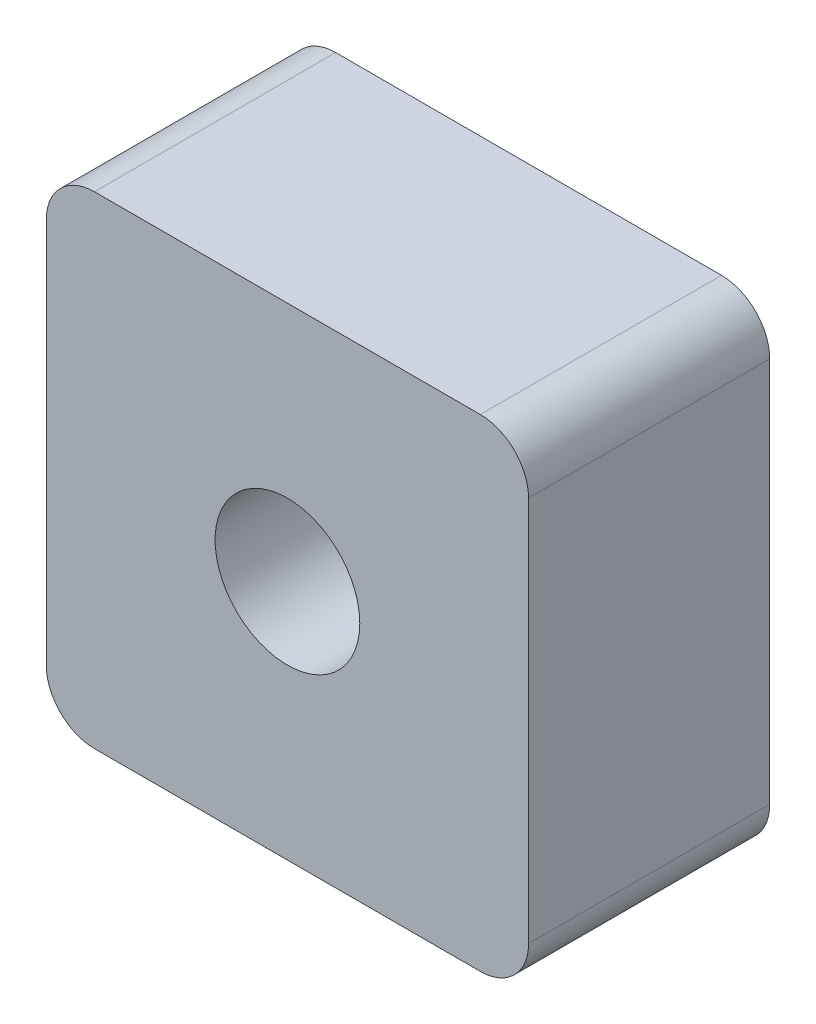
ISO-10303-21;
HEADER;
FILE_DESCRIPTION(('STEP AP214'),'2;1');
FILE_NAME('part.step','',(''),(''),'','','');
FILE_SCHEMA(('AUTOMOTIVE_DESIGN { 1 0 10303 214 1 1 1 1 }'));
ENDSEC;
DATA;
#1=APPLICATION_CONTEXT('core data for automotive mechanical design processes');
#2=APPLICATION_PROTOCOL_DEFINITION('international standard','automotive_design',2000,#1);
#3=PRODUCT_CONTEXT('',#1,'mechanical');
#4=PRODUCT('Part','Part','',(#3));
#5=PRODUCT_RELATED_PRODUCT_CATEGORY('part','',(#4));
#6=PRODUCT_DEFINITION_FORMATION('','',#4);
#7=PRODUCT_DEFINITION_CONTEXT('part definition',#1,'design');
#8=PRODUCT_DEFINITION('design','',#6,#7);
#9=PRODUCT_DEFINITION_SHAPE('','',#8);
#10=(LENGTH_UNIT() NAMED_UNIT(*) SI_UNIT(.MILLI.,.METRE.));
#11=(NAMED_UNIT(*) PLANE_ANGLE_UNIT() SI_UNIT($,.RADIAN.));
#12=(NAMED_UNIT(*) SI_UNIT($,.STERADIAN.) SOLID_ANGLE_UNIT());
#13=UNCERTAINTY_MEASURE_WITH_UNIT(LENGTH_MEASURE(1.E-05),#10,'distance_accuracy_value','');
#14=(GEOMETRIC_REPRESENTATION_CONTEXT(3) GLOBAL_UNCERTAINTY_ASSIGNED_CONTEXT((#13)) GLOBAL_UNIT_ASSIGNED_CONTEXT((#10,
#11,#12)) REPRESENTATION_CONTEXT('',''));
#15=CARTESIAN_POINT('',(0.,0.,0.));
#16=DIRECTION('',(0.,0.,1.));
#17=DIRECTION('',(1.,0.,0.));
#18=AXIS2_PLACEMENT_3D('',#15,#16,#17);
#19=CARTESIAN_POINT('',(0.,0.,0.));
#20=DIRECTION('',(0.,0.,1.));
#21=DIRECTION('',(1.,0.,0.));
#22=AXIS2_PLACEMENT_3D('',#19,#20,#21);
#23=PLANE('',#22);
#24=CARTESIAN_POINT('',(0.,0.,0.));
#25=DIRECTION('',(0.,0.,1.));
#26=DIRECTION('',(1.,0.,0.));
#27=AXIS2_PLACEMENT_3D('',#24,#25,#26);
#28=CIRCLE('',#27,3.);
#29=CARTESIAN_POINT('',(3.,0.,0.));
#30=VERTEX_POINT('',#29);
#31=EDGE_CURVE('E129',#30,#30,#28,.T.);
#32=ORIENTED_EDGE('',*,*,#31,.T.);
#33=EDGE_LOOP('',(#32));
#34=FACE_BOUND('',#33,.T.);
#35=DIRECTION('',(0.,1.,0.));
#36=VECTOR('',#35,1.);
#37=CARTESIAN_POINT('',(10.,8.,0.));
#38=LINE('',#37,#36);
#39=CARTESIAN_POINT('',(10.,-8.,0.));
#40=VERTEX_POINT('',#39);
#41=CARTESIAN_POINT('',(10.,8.,0.));
#42=VERTEX_POINT('',#41);
#43=EDGE_CURVE('E78',#40,#42,#38,.T.);
#44=ORIENTED_EDGE('',*,*,#43,.F.);
#45=CARTESIAN_POINT('',(8.,-8.,0.));
#46=DIRECTION('',(0.,0.,1.));
#47=DIRECTION('',(1.,0.,0.));
#48=AXIS2_PLACEMENT_3D('',#45,#46,#47);
#49=CIRCLE('',#48,2.);
#50=CARTESIAN_POINT('',(8.,-10.,0.));
#51=VERTEX_POINT('',#50);
#52=EDGE_CURVE('E133',#51,#40,#49,.T.);
#53=ORIENTED_EDGE('',*,*,#52,.F.);
#54=DIRECTION('',(1.,0.,0.));
#55=VECTOR('',#54,1.);
#56=CARTESIAN_POINT('',(8.,-10.,0.));
#57=LINE('',#56,#55);
#58=CARTESIAN_POINT('',(-8.,-10.,0.));
#59=VERTEX_POINT('',#58);
#60=EDGE_CURVE('E109',#59,#51,#57,.T.);
#61=ORIENTED_EDGE('',*,*,#60,.F.);
#62=CARTESIAN_POINT('',(-8.,-8.,0.));
#63=DIRECTION('',(0.,0.,1.));
#64=DIRECTION('',(1.,0.,0.));
#65=AXIS2_PLACEMENT_3D('',#62,#63,#64);
#66=CIRCLE('',#65,2.);
#67=CARTESIAN_POINT('',(-10.,-8.,0.));
#68=VERTEX_POINT('',#67);
#69=EDGE_CURVE('E136',#68,#59,#66,.T.);
#70=ORIENTED_EDGE('',*,*,#69,.F.);
#71=DIRECTION('',(0.,1.,0.));
#72=VECTOR('',#71,1.);
#73=CARTESIAN_POINT('',(-10.,-8.,0.));
#74=LINE('',#73,#72);
#75=CARTESIAN_POINT('',(-10.,8.,0.));
#76=VERTEX_POINT('',#75);
#77=EDGE_CURVE('E112',#76,#68,#74,.F.);
#78=ORIENTED_EDGE('',*,*,#77,.F.);
#79=CARTESIAN_POINT('',(-8.,8.,0.));
#80=DIRECTION('',(0.,0.,1.));
#81=DIRECTION('',(1.,0.,0.));
#82=AXIS2_PLACEMENT_3D('',#79,#80,#81);
#83=CIRCLE('',#82,2.);
#84=CARTESIAN_POINT('',(-8.,10.,0.));
#85=VERTEX_POINT('',#84);
#86=EDGE_CURVE('E94',#85,#76,#83,.T.);
#87=ORIENTED_EDGE('',*,*,#86,.F.);
#88=DIRECTION('',(1.,0.,0.));
#89=VECTOR('',#88,1.);
#90=CARTESIAN_POINT('',(-8.,10.,0.));
#91=LINE('',#90,#89);
#92=CARTESIAN_POINT('',(8.,10.,0.));
#93=VERTEX_POINT('',#92);
#94=EDGE_CURVE('E92',#93,#85,#91,.F.);
#95=ORIENTED_EDGE('',*,*,#94,.F.);
#96=CARTESIAN_POINT('',(8.,8.,0.));
#97=DIRECTION('',(0.,0.,1.));
#98=DIRECTION('',(1.,0.,0.));
#99=AXIS2_PLACEMENT_3D('',#96,#97,#98);
#100=CIRCLE('',#99,2.);
#101=EDGE_CURVE('E20',#42,#93,#100,.T.);
#102=ORIENTED_EDGE('',*,*,#101,.F.);
#103=EDGE_LOOP('',(#44,#53,#61,#70,#78,#87,#95,#102));
#104=FACE_BOUND('',#103,.T.);
#105=ADVANCED_FACE('F17',(#34,#104),#23,.F.);
#106=CARTESIAN_POINT('',(10.,8.,0.));
#107=DIRECTION('',(1.,0.,0.));
#108=DIRECTION('',(0.,0.,-1.));
#109=AXIS2_PLACEMENT_3D('',#106,#107,#108);
#110=PLANE('',#109);
#111=ORIENTED_EDGE('',*,*,#43,.T.);
#112=DIRECTION('',(0.,0.,1.));
#113=VECTOR('',#112,1.);
#114=CARTESIAN_POINT('',(10.,8.,0.));
#115=LINE('',#114,#113);
#116=CARTESIAN_POINT('',(10.,8.,10.));
#117=VERTEX_POINT('',#116);
#118=EDGE_CURVE('E89',#117,#42,#115,.F.);
#119=ORIENTED_EDGE('',*,*,#118,.F.);
#120=DIRECTION('',(0.,1.,0.));
#121=VECTOR('',#120,1.);
#122=CARTESIAN_POINT('',(10.,0.,10.));
#123=LINE('',#122,#121);
#124=CARTESIAN_POINT('',(10.,-8.,10.));
#125=VERTEX_POINT('',#124);
#126=EDGE_CURVE('E128',#125,#117,#123,.T.);
#127=ORIENTED_EDGE('',*,*,#126,.F.);
#128=DIRECTION('',(0.,0.,1.));
#129=VECTOR('',#128,1.);
#130=CARTESIAN_POINT('',(10.,-8.,0.));
#131=LINE('',#130,#129);
#132=EDGE_CURVE('E132',#40,#125,#131,.T.);
#133=ORIENTED_EDGE('',*,*,#132,.F.);
#134=EDGE_LOOP('',(#111,#119,#127,#133));
#135=FACE_BOUND('',#134,.T.);
#136=ADVANCED_FACE('F169',(#135),#110,.T.);
#137=CARTESIAN_POINT('',(8.,8.,0.));
#138=DIRECTION('',(0.,0.,1.));
#139=DIRECTION('',(1.,0.,0.));
#140=AXIS2_PLACEMENT_3D('',#137,#138,#139);
#141=CYLINDRICAL_SURFACE('',#140,2.);
#142=ORIENTED_EDGE('',*,*,#101,.T.);
#143=DIRECTION('',(0.,0.,1.));
#144=VECTOR('',#143,1.);
#145=CARTESIAN_POINT('',(8.,10.,0.));
#146=LINE('',#145,#144);
#147=CARTESIAN_POINT('',(8.,10.,10.));
#148=VERTEX_POINT('',#147);
#149=EDGE_CURVE('E87',#148,#93,#146,.F.);
#150=ORIENTED_EDGE('',*,*,#149,.F.);
#151=CARTESIAN_POINT('',(8.,8.,10.));
#152=DIRECTION('',(0.,0.,1.));
#153=DIRECTION('',(1.,0.,0.));
#154=AXIS2_PLACEMENT_3D('',#151,#152,#153);
#155=CIRCLE('',#154,2.);
#156=EDGE_CURVE('E126',#117,#148,#155,.T.);
#157=ORIENTED_EDGE('',*,*,#156,.F.);
#158=ORIENTED_EDGE('',*,*,#118,.T.);
#159=EDGE_LOOP('',(#142,#150,#157,#158));
#160=FACE_BOUND('',#159,.T.);
#161=ADVANCED_FACE('F84',(#160),#141,.T.);
#162=CARTESIAN_POINT('',(-8.,10.,0.));
#163=DIRECTION('',(0.,1.,0.));
#164=DIRECTION('',(0.,0.,1.));
#165=AXIS2_PLACEMENT_3D('',#162,#163,#164);
#166=PLANE('',#165);
#167=ORIENTED_EDGE('',*,*,#94,.T.);
#168=DIRECTION('',(0.,0.,1.));
#169=VECTOR('',#168,1.);
#170=CARTESIAN_POINT('',(-8.,10.,0.));
#171=LINE('',#170,#169);
#172=CARTESIAN_POINT('',(-8.,10.,10.));
#173=VERTEX_POINT('',#172);
#174=EDGE_CURVE('E97',#173,#85,#171,.F.);
#175=ORIENTED_EDGE('',*,*,#174,.F.);
#176=DIRECTION('',(1.,0.,0.));
#177=VECTOR('',#176,1.);
#178=CARTESIAN_POINT('',(0.,10.,10.));
#179=LINE('',#178,#177);
#180=EDGE_CURVE('E101',#148,#173,#179,.F.);
#181=ORIENTED_EDGE('',*,*,#180,.F.);
#182=ORIENTED_EDGE('',*,*,#149,.T.);
#183=EDGE_LOOP('',(#167,#175,#181,#182));
#184=FACE_BOUND('',#183,.T.);
#185=ADVANCED_FACE('F99',(#184),#166,.T.);
#186=CARTESIAN_POINT('',(-8.,8.,0.));
#187=DIRECTION('',(0.,0.,1.));
#188=DIRECTION('',(1.,0.,0.));
#189=AXIS2_PLACEMENT_3D('',#186,#187,#188);
#190=CYLINDRICAL_SURFACE('',#189,2.);
#191=ORIENTED_EDGE('',*,*,#86,.T.);
#192=DIRECTION('',(0.,0.,1.));
#193=VECTOR('',#192,1.);
#194=CARTESIAN_POINT('',(-10.,8.,0.));
#195=LINE('',#194,#193);
#196=CARTESIAN_POINT('',(-10.,8.,10.));
#197=VERTEX_POINT('',#196);
#198=EDGE_CURVE('E114',#197,#76,#195,.F.);
#199=ORIENTED_EDGE('',*,*,#198,.F.);
#200=CARTESIAN_POINT('',(-8.,8.,10.));
#201=DIRECTION('',(0.,0.,1.));
#202=DIRECTION('',(1.,0.,0.));
#203=AXIS2_PLACEMENT_3D('',#200,#201,#202);
#204=CIRCLE('',#203,2.);
#205=EDGE_CURVE('E123',#173,#197,#204,.T.);
#206=ORIENTED_EDGE('',*,*,#205,.F.);
#207=ORIENTED_EDGE('',*,*,#174,.T.);
#208=EDGE_LOOP('',(#191,#199,#206,#207));
#209=FACE_BOUND('',#208,.T.);
#210=ADVANCED_FACE('F140',(#209),#190,.T.);
#211=CARTESIAN_POINT('',(-10.,-8.,0.));
#212=DIRECTION('',(-1.,0.,0.));
#213=DIRECTION('',(0.,0.,1.));
#214=AXIS2_PLACEMENT_3D('',#211,#212,#213);
#215=PLANE('',#214);
#216=ORIENTED_EDGE('',*,*,#77,.T.);
#217=DIRECTION('',(0.,0.,1.));
#218=VECTOR('',#217,1.);
#219=CARTESIAN_POINT('',(-10.,-8.,0.));
#220=LINE('',#219,#218);
#221=CARTESIAN_POINT('',(-10.,-8.,10.));
#222=VERTEX_POINT('',#221);
#223=EDGE_CURVE('E113',#222,#68,#220,.F.);
#224=ORIENTED_EDGE('',*,*,#223,.F.);
#225=DIRECTION('',(0.,1.,0.));
#226=VECTOR('',#225,1.);
#227=CARTESIAN_POINT('',(-10.,0.,10.));
#228=LINE('',#227,#226);
#229=EDGE_CURVE('E122',#197,#222,#228,.F.);
#230=ORIENTED_EDGE('',*,*,#229,.F.);
#231=ORIENTED_EDGE('',*,*,#198,.T.);
#232=EDGE_LOOP('',(#216,#224,#230,#231));
#233=FACE_BOUND('',#232,.T.);
#234=ADVANCED_FACE('F164',(#233),#215,.T.);
#235=CARTESIAN_POINT('',(-8.,-8.,0.));
#236=DIRECTION('',(0.,0.,1.));
#237=DIRECTION('',(1.,0.,0.));
#238=AXIS2_PLACEMENT_3D('',#235,#236,#237);
#239=CYLINDRICAL_SURFACE('',#238,2.);
#240=ORIENTED_EDGE('',*,*,#69,.T.);
#241=DIRECTION('',(0.,0.,-1.));
#242=VECTOR('',#241,1.);
#243=CARTESIAN_POINT('',(-8.,-10.,0.));
#244=LINE('',#243,#242);
#245=CARTESIAN_POINT('',(-8.,-10.,10.));
#246=VERTEX_POINT('',#245);
#247=EDGE_CURVE('E111',#246,#59,#244,.T.);
#248=ORIENTED_EDGE('',*,*,#247,.F.);
#249=CARTESIAN_POINT('',(-8.,-8.,10.));
#250=DIRECTION('',(0.,0.,1.));
#251=DIRECTION('',(1.,0.,0.));
#252=AXIS2_PLACEMENT_3D('',#249,#250,#251);
#253=CIRCLE('',#252,2.);
#254=EDGE_CURVE('E119',#222,#246,#253,.T.);
#255=ORIENTED_EDGE('',*,*,#254,.F.);
#256=ORIENTED_EDGE('',*,*,#223,.T.);
#257=EDGE_LOOP('',(#240,#248,#255,#256));
#258=FACE_BOUND('',#257,.T.);
#259=ADVANCED_FACE('F160',(#258),#239,.T.);
#260=CARTESIAN_POINT('',(8.,-10.,0.));
#261=DIRECTION('',(0.,-1.,0.));
#262=DIRECTION('',(0.,0.,-1.));
#263=AXIS2_PLACEMENT_3D('',#260,#261,#262);
#264=PLANE('',#263);
#265=ORIENTED_EDGE('',*,*,#60,.T.);
#266=DIRECTION('',(0.,0.,1.));
#267=VECTOR('',#266,1.);
#268=CARTESIAN_POINT('',(8.,-10.,0.));
#269=LINE('',#268,#267);
#270=CARTESIAN_POINT('',(8.,-10.,10.));
#271=VERTEX_POINT('',#270);
#272=EDGE_CURVE('E35',#271,#51,#269,.F.);
#273=ORIENTED_EDGE('',*,*,#272,.F.);
#274=DIRECTION('',(1.,0.,0.));
#275=VECTOR('',#274,1.);
#276=CARTESIAN_POINT('',(0.,-10.,10.));
#277=LINE('',#276,#275);
#278=EDGE_CURVE('E118',#246,#271,#277,.T.);
#279=ORIENTED_EDGE('',*,*,#278,.F.);
#280=ORIENTED_EDGE('',*,*,#247,.T.);
#281=EDGE_LOOP('',(#265,#273,#279,#280));
#282=FACE_BOUND('',#281,.T.);
#283=ADVANCED_FACE('F166',(#282),#264,.T.);
#284=CARTESIAN_POINT('',(8.,-8.,0.));
#285=DIRECTION('',(0.,0.,1.));
#286=DIRECTION('',(1.,0.,0.));
#287=AXIS2_PLACEMENT_3D('',#284,#285,#286);
#288=CYLINDRICAL_SURFACE('',#287,2.);
#289=ORIENTED_EDGE('',*,*,#52,.T.);
#290=ORIENTED_EDGE('',*,*,#132,.T.);
#291=CARTESIAN_POINT('',(8.,-8.,10.));
#292=DIRECTION('',(0.,0.,1.));
#293=DIRECTION('',(1.,0.,0.));
#294=AXIS2_PLACEMENT_3D('',#291,#292,#293);
#295=CIRCLE('',#294,2.);
#296=EDGE_CURVE('E26',#271,#125,#295,.T.);
#297=ORIENTED_EDGE('',*,*,#296,.F.);
#298=ORIENTED_EDGE('',*,*,#272,.T.);
#299=EDGE_LOOP('',(#289,#290,#297,#298));
#300=FACE_BOUND('',#299,.T.);
#301=ADVANCED_FACE('F168',(#300),#288,.T.);
#302=CARTESIAN_POINT('',(0.,0.,0.));
#303=DIRECTION('',(0.,0.,1.));
#304=DIRECTION('',(1.,0.,0.));
#305=AXIS2_PLACEMENT_3D('',#302,#303,#304);
#306=CYLINDRICAL_SURFACE('',#305,3.);
#307=ORIENTED_EDGE('',*,*,#31,.F.);
#308=EDGE_LOOP('',(#307));
#309=FACE_BOUND('',#308,.T.);
#310=CARTESIAN_POINT('',(0.,0.,10.));
#311=DIRECTION('',(0.,0.,1.));
#312=DIRECTION('',(1.,0.,0.));
#313=AXIS2_PLACEMENT_3D('',#310,#311,#312);
#314=CIRCLE('',#313,3.);
#315=CARTESIAN_POINT('',(3.,0.,10.));
#316=VERTEX_POINT('',#315);
#317=EDGE_CURVE('E11',#316,#316,#314,.F.);
#318=ORIENTED_EDGE('',*,*,#317,.F.);
#319=EDGE_LOOP('',(#318));
#320=FACE_BOUND('',#319,.T.);
#321=ADVANCED_FACE('F179',(#309,#320),#306,.F.);
#322=CARTESIAN_POINT('',(0.,0.,10.));
#323=DIRECTION('',(0.,0.,1.));
#324=DIRECTION('',(1.,0.,0.));
#325=AXIS2_PLACEMENT_3D('',#322,#323,#324);
#326=PLANE('',#325);
#327=ORIENTED_EDGE('',*,*,#317,.T.);
#328=EDGE_LOOP('',(#327));
#329=FACE_BOUND('',#328,.T.);
#330=ORIENTED_EDGE('',*,*,#278,.T.);
#331=ORIENTED_EDGE('',*,*,#296,.T.);
#332=ORIENTED_EDGE('',*,*,#126,.T.);
#333=ORIENTED_EDGE('',*,*,#156,.T.);
#334=ORIENTED_EDGE('',*,*,#180,.T.);
#335=ORIENTED_EDGE('',*,*,#205,.T.);
#336=ORIENTED_EDGE('',*,*,#229,.T.);
#337=ORIENTED_EDGE('',*,*,#254,.T.);
#338=EDGE_LOOP('',(#330,#331,#332,#333,#334,#335,#336,#337));
#339=FACE_BOUND('',#338,.T.);
#340=ADVANCED_FACE('F145',(#329,#339),#326,.T.);
#341=CLOSED_SHELL('',(#105,#136,#161,#185,#210,#234,#259,#283,#301,#321,#340));
#342=MANIFOLD_SOLID_BREP('B1',#341);
#343=ADVANCED_BREP_SHAPE_REPRESENTATION('',(#18,#342),#14);
#344=SHAPE_DEFINITION_REPRESENTATION(#9,#343);
ENDSEC;
END-ISO-10303-21;
